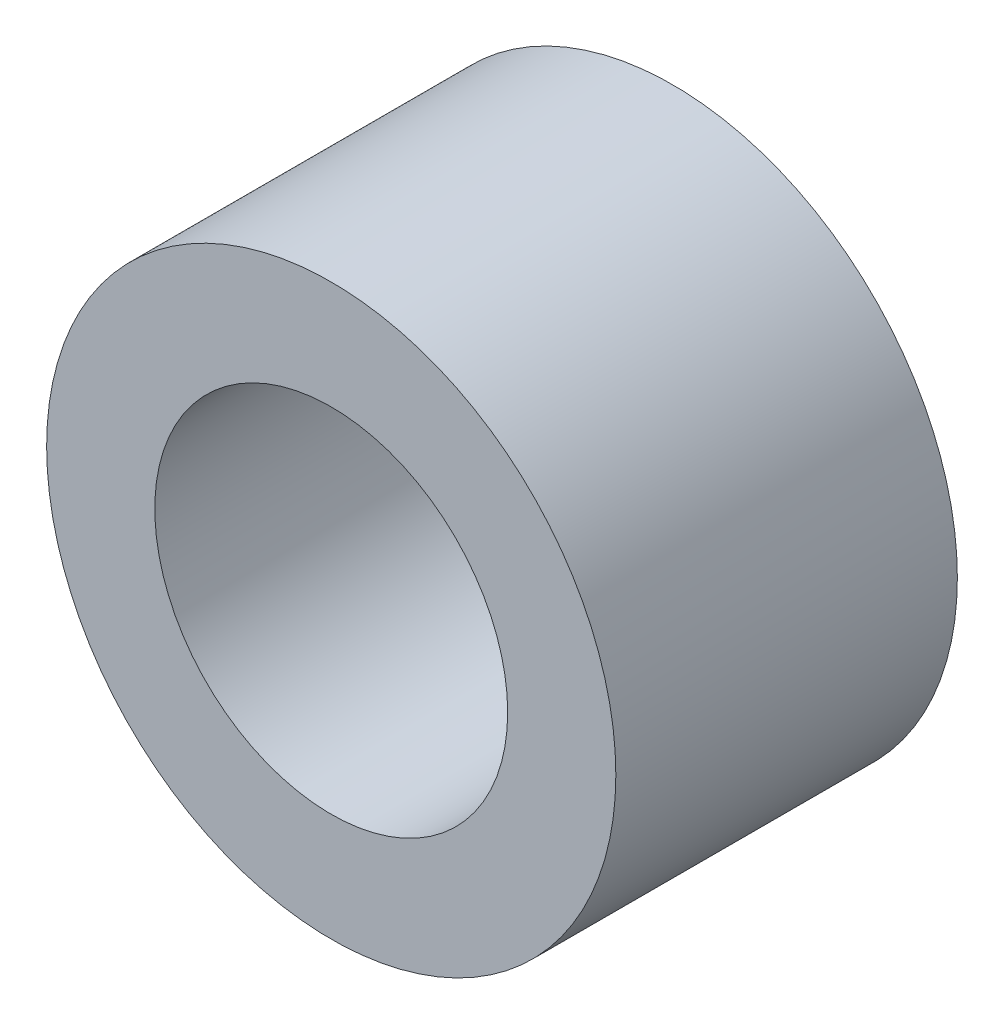
ISO-10303-21;
HEADER;
FILE_DESCRIPTION(('STEP AP214'),'2;1');
FILE_NAME('part.step','',(''),(''),'','','');
FILE_SCHEMA(('AUTOMOTIVE_DESIGN { 1 0 10303 214 1 1 1 1 }'));
ENDSEC;
DATA;
#1=APPLICATION_CONTEXT('core data for automotive mechanical design processes');
#2=APPLICATION_PROTOCOL_DEFINITION('international standard','automotive_design',2000,#1);
#3=PRODUCT_CONTEXT('',#1,'mechanical');
#4=PRODUCT('Part','Part','',(#3));
#5=PRODUCT_RELATED_PRODUCT_CATEGORY('part','',(#4));
#6=PRODUCT_DEFINITION_FORMATION('','',#4);
#7=PRODUCT_DEFINITION_CONTEXT('part definition',#1,'design');
#8=PRODUCT_DEFINITION('design','',#6,#7);
#9=PRODUCT_DEFINITION_SHAPE('','',#8);
#10=(LENGTH_UNIT() NAMED_UNIT(*) SI_UNIT(.MILLI.,.METRE.));
#11=(NAMED_UNIT(*) PLANE_ANGLE_UNIT() SI_UNIT($,.RADIAN.));
#12=(NAMED_UNIT(*) SI_UNIT($,.STERADIAN.) SOLID_ANGLE_UNIT());
#13=UNCERTAINTY_MEASURE_WITH_UNIT(LENGTH_MEASURE(1.E-05),#10,'distance_accuracy_value','');
#14=(GEOMETRIC_REPRESENTATION_CONTEXT(3) GLOBAL_UNCERTAINTY_ASSIGNED_CONTEXT((#13)) GLOBAL_UNIT_ASSIGNED_CONTEXT((#10,
#11,#12)) REPRESENTATION_CONTEXT('',''));
#15=CARTESIAN_POINT('',(0.,0.,0.));
#16=DIRECTION('',(0.,0.,1.));
#17=DIRECTION('',(1.,0.,0.));
#18=AXIS2_PLACEMENT_3D('',#15,#16,#17);
#19=CARTESIAN_POINT('',(0.,0.,6.));
#20=DIRECTION('',(0.,0.,1.));
#21=DIRECTION('',(1.,0.,0.));
#22=AXIS2_PLACEMENT_3D('',#19,#20,#21);
#23=PLANE('',#22);
#24=CARTESIAN_POINT('',(0.,0.,6.));
#25=DIRECTION('',(0.,0.,1.));
#26=DIRECTION('',(1.,0.,0.));
#27=AXIS2_PLACEMENT_3D('',#24,#25,#26);
#28=CIRCLE('',#27,5.);
#29=CARTESIAN_POINT('',(5.,0.,6.));
#30=VERTEX_POINT('',#29);
#31=EDGE_CURVE('E10',#30,#30,#28,.T.);
#32=ORIENTED_EDGE('',*,*,#31,.T.);
#33=EDGE_LOOP('',(#32));
#34=FACE_BOUND('',#33,.T.);
#35=CARTESIAN_POINT('',(0.,0.,6.));
#36=DIRECTION('',(0.,0.,1.));
#37=DIRECTION('',(1.,0.,0.));
#38=AXIS2_PLACEMENT_3D('',#35,#36,#37);
#39=CIRCLE('',#38,3.1);
#40=CARTESIAN_POINT('',(3.1,0.,6.));
#41=VERTEX_POINT('',#40);
#42=EDGE_CURVE('E44',#41,#41,#39,.T.);
#43=ORIENTED_EDGE('',*,*,#42,.F.);
#44=EDGE_LOOP('',(#43));
#45=FACE_BOUND('',#44,.T.);
#46=ADVANCED_FACE('F33',(#34,#45),#23,.T.);
#47=CARTESIAN_POINT('',(0.,0.,0.));
#48=DIRECTION('',(0.,0.,1.));
#49=DIRECTION('',(1.,0.,0.));
#50=AXIS2_PLACEMENT_3D('',#47,#48,#49);
#51=PLANE('',#50);
#52=CARTESIAN_POINT('',(0.,0.,0.));
#53=DIRECTION('',(0.,0.,1.));
#54=DIRECTION('',(1.,0.,0.));
#55=AXIS2_PLACEMENT_3D('',#52,#53,#54);
#56=CIRCLE('',#55,5.);
#57=CARTESIAN_POINT('',(5.,0.,0.));
#58=VERTEX_POINT('',#57);
#59=EDGE_CURVE('E37',#58,#58,#56,.T.);
#60=ORIENTED_EDGE('',*,*,#59,.F.);
#61=EDGE_LOOP('',(#60));
#62=FACE_BOUND('',#61,.T.);
#63=CARTESIAN_POINT('',(0.,0.,0.));
#64=DIRECTION('',(0.,0.,1.));
#65=DIRECTION('',(1.,0.,0.));
#66=AXIS2_PLACEMENT_3D('',#63,#64,#65);
#67=CIRCLE('',#66,3.1);
#68=CARTESIAN_POINT('',(3.1,0.,0.));
#69=VERTEX_POINT('',#68);
#70=EDGE_CURVE('E46',#69,#69,#67,.T.);
#71=ORIENTED_EDGE('',*,*,#70,.T.);
#72=EDGE_LOOP('',(#71));
#73=FACE_BOUND('',#72,.T.);
#74=ADVANCED_FACE('F56',(#62,#73),#51,.F.);
#75=CARTESIAN_POINT('',(0.,0.,6.));
#76=DIRECTION('',(0.,0.,-1.));
#77=DIRECTION('',(-1.,0.,0.));
#78=AXIS2_PLACEMENT_3D('',#75,#76,#77);
#79=CYLINDRICAL_SURFACE('',#78,5.);
#80=ORIENTED_EDGE('',*,*,#31,.F.);
#81=EDGE_LOOP('',(#80));
#82=FACE_BOUND('',#81,.T.);
#83=ORIENTED_EDGE('',*,*,#59,.T.);
#84=EDGE_LOOP('',(#83));
#85=FACE_BOUND('',#84,.T.);
#86=ADVANCED_FACE('F35',(#82,#85),#79,.T.);
#87=CARTESIAN_POINT('',(0.,0.,6.));
#88=DIRECTION('',(0.,0.,-1.));
#89=DIRECTION('',(-1.,0.,0.));
#90=AXIS2_PLACEMENT_3D('',#87,#88,#89);
#91=CYLINDRICAL_SURFACE('',#90,3.1);
#92=ORIENTED_EDGE('',*,*,#42,.T.);
#93=EDGE_LOOP('',(#92));
#94=FACE_BOUND('',#93,.T.);
#95=ORIENTED_EDGE('',*,*,#70,.F.);
#96=EDGE_LOOP('',(#95));
#97=FACE_BOUND('',#96,.T.);
#98=ADVANCED_FACE('F52',(#94,#97),#91,.F.);
#99=CLOSED_SHELL('',(#46,#74,#86,#98));
#100=MANIFOLD_SOLID_BREP('B2',#99);
#101=ADVANCED_BREP_SHAPE_REPRESENTATION('',(#18,#100),#14);
#102=SHAPE_DEFINITION_REPRESENTATION(#9,#101);
ENDSEC;
END-ISO-10303-21;
